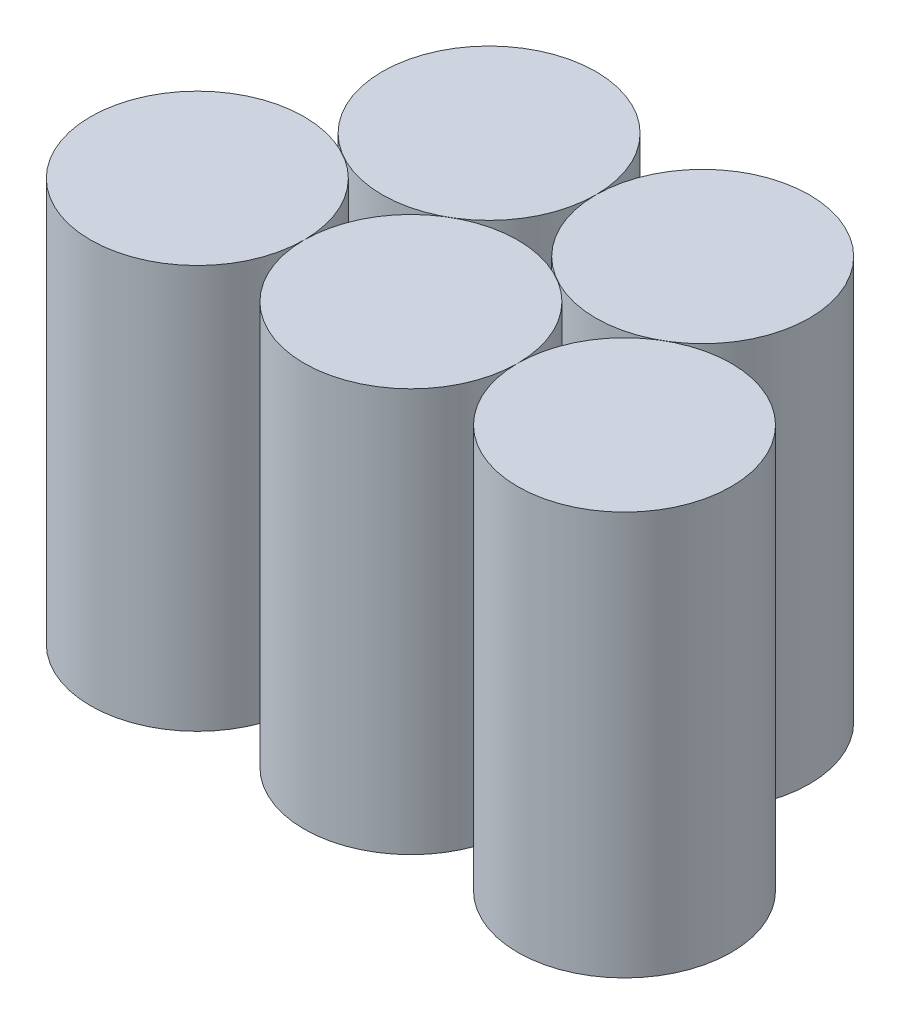
ISO-10303-21;
HEADER;
FILE_DESCRIPTION(('STEP AP214'),'2;1');
FILE_NAME('part.step','',(''),(''),'','','');
FILE_SCHEMA(('AUTOMOTIVE_DESIGN { 1 0 10303 214 1 1 1 1 }'));
ENDSEC;
DATA;
#1=APPLICATION_CONTEXT('core data for automotive mechanical design processes');
#2=APPLICATION_PROTOCOL_DEFINITION('international standard','automotive_design',2000,#1);
#3=PRODUCT_CONTEXT('',#1,'mechanical');
#4=PRODUCT('Part','Part','',(#3));
#5=PRODUCT_RELATED_PRODUCT_CATEGORY('part','',(#4));
#6=PRODUCT_DEFINITION_FORMATION('','',#4);
#7=PRODUCT_DEFINITION_CONTEXT('part definition',#1,'design');
#8=PRODUCT_DEFINITION('design','',#6,#7);
#9=PRODUCT_DEFINITION_SHAPE('','',#8);
#10=(LENGTH_UNIT() NAMED_UNIT(*) SI_UNIT(.MILLI.,.METRE.));
#11=(NAMED_UNIT(*) PLANE_ANGLE_UNIT() SI_UNIT($,.RADIAN.));
#12=(NAMED_UNIT(*) SI_UNIT($,.STERADIAN.) SOLID_ANGLE_UNIT());
#13=UNCERTAINTY_MEASURE_WITH_UNIT(LENGTH_MEASURE(1.E-05),#10,'distance_accuracy_value','');
#14=(GEOMETRIC_REPRESENTATION_CONTEXT(3) GLOBAL_UNCERTAINTY_ASSIGNED_CONTEXT((#13)) GLOBAL_UNIT_ASSIGNED_CONTEXT((#10,
#11,#12)) REPRESENTATION_CONTEXT('',''));
#15=CARTESIAN_POINT('',(0.,0.,0.));
#16=DIRECTION('',(0.,0.,1.));
#17=DIRECTION('',(1.,0.,0.));
#18=AXIS2_PLACEMENT_3D('',#15,#16,#17);
#19=CARTESIAN_POINT('',(22.86,43.18,11.43));
#20=DIRECTION('',(0.,-1.,0.));
#21=DIRECTION('',(0.,0.,-1.));
#22=AXIS2_PLACEMENT_3D('',#19,#20,#21);
#23=CYLINDRICAL_SURFACE('',#22,11.43);
#24=CARTESIAN_POINT('',(22.86,43.18,11.43));
#25=DIRECTION('',(0.,1.,0.));
#26=DIRECTION('',(0.,0.,1.));
#27=AXIS2_PLACEMENT_3D('',#24,#25,#26);
#28=CIRCLE('',#27,11.43);
#29=CARTESIAN_POINT('',(22.86,43.18,22.86));
#30=VERTEX_POINT('',#29);
#31=EDGE_CURVE('E12',#30,#30,#28,.T.);
#32=ORIENTED_EDGE('',*,*,#31,.F.);
#33=EDGE_LOOP('',(#32));
#34=FACE_BOUND('',#33,.T.);
#35=CARTESIAN_POINT('',(22.86,0.,11.43));
#36=DIRECTION('',(0.,1.,0.));
#37=DIRECTION('',(0.,0.,1.));
#38=AXIS2_PLACEMENT_3D('',#35,#36,#37);
#39=CIRCLE('',#38,11.43);
#40=CARTESIAN_POINT('',(22.86,0.,22.86));
#41=VERTEX_POINT('',#40);
#42=EDGE_CURVE('E85',#41,#41,#39,.T.);
#43=ORIENTED_EDGE('',*,*,#42,.T.);
#44=EDGE_LOOP('',(#43));
#45=FACE_BOUND('',#44,.T.);
#46=ADVANCED_FACE('F82',(#34,#45),#23,.T.);
#47=CARTESIAN_POINT('',(0.,43.18,0.));
#48=DIRECTION('',(0.,1.,0.));
#49=DIRECTION('',(0.,0.,1.));
#50=AXIS2_PLACEMENT_3D('',#47,#48,#49);
#51=PLANE('',#50);
#52=ORIENTED_EDGE('',*,*,#31,.T.);
#53=EDGE_LOOP('',(#52));
#54=FACE_BOUND('',#53,.T.);
#55=ADVANCED_FACE('F97',(#54),#51,.T.);
#56=CARTESIAN_POINT('',(0.,0.,0.));
#57=DIRECTION('',(0.,1.,0.));
#58=DIRECTION('',(0.,0.,1.));
#59=AXIS2_PLACEMENT_3D('',#56,#57,#58);
#60=PLANE('',#59);
#61=ORIENTED_EDGE('',*,*,#42,.F.);
#62=EDGE_LOOP('',(#61));
#63=FACE_BOUND('',#62,.T.);
#64=ADVANCED_FACE('F95',(#63),#60,.F.);
#65=CLOSED_SHELL('',(#46,#55,#64));
#66=MANIFOLD_SOLID_BREP('B2',#65);
#67=CARTESIAN_POINT('',(11.43,43.18,-8.36734073051227));
#68=DIRECTION('',(0.,-1.,0.));
#69=DIRECTION('',(0.,0.,-1.));
#70=AXIS2_PLACEMENT_3D('',#67,#68,#69);
#71=CYLINDRICAL_SURFACE('',#70,11.43);
#72=CARTESIAN_POINT('',(11.43,43.18,-8.36734073051227));
#73=DIRECTION('',(0.,1.,0.));
#74=DIRECTION('',(0.,0.,1.));
#75=AXIS2_PLACEMENT_3D('',#72,#73,#74);
#76=CIRCLE('',#75,11.43);
#77=CARTESIAN_POINT('',(11.43,43.18,3.06265926948773));
#78=VERTEX_POINT('',#77);
#79=EDGE_CURVE('E81',#78,#78,#76,.T.);
#80=ORIENTED_EDGE('',*,*,#79,.F.);
#81=EDGE_LOOP('',(#80));
#82=FACE_BOUND('',#81,.T.);
#83=CARTESIAN_POINT('',(11.43,0.,-8.36734073051227));
#84=DIRECTION('',(0.,1.,0.));
#85=DIRECTION('',(0.,0.,1.));
#86=AXIS2_PLACEMENT_3D('',#83,#84,#85);
#87=CIRCLE('',#86,11.43);
#88=CARTESIAN_POINT('',(11.43,0.,3.06265926948773));
#89=VERTEX_POINT('',#88);
#90=EDGE_CURVE('E134',#89,#89,#87,.T.);
#91=ORIENTED_EDGE('',*,*,#90,.T.);
#92=EDGE_LOOP('',(#91));
#93=FACE_BOUND('',#92,.T.);
#94=ADVANCED_FACE('F131',(#82,#93),#71,.T.);
#95=CARTESIAN_POINT('',(0.,43.18,0.));
#96=DIRECTION('',(0.,1.,0.));
#97=DIRECTION('',(0.,0.,1.));
#98=AXIS2_PLACEMENT_3D('',#95,#96,#97);
#99=PLANE('',#98);
#100=ORIENTED_EDGE('',*,*,#79,.T.);
#101=EDGE_LOOP('',(#100));
#102=FACE_BOUND('',#101,.T.);
#103=ADVANCED_FACE('F146',(#102),#99,.T.);
#104=CARTESIAN_POINT('',(0.,0.,0.));
#105=DIRECTION('',(0.,1.,0.));
#106=DIRECTION('',(0.,0.,1.));
#107=AXIS2_PLACEMENT_3D('',#104,#105,#106);
#108=PLANE('',#107);
#109=ORIENTED_EDGE('',*,*,#90,.F.);
#110=EDGE_LOOP('',(#109));
#111=FACE_BOUND('',#110,.T.);
#112=ADVANCED_FACE('F144',(#111),#108,.F.);
#113=CLOSED_SHELL('',(#94,#103,#112));
#114=MANIFOLD_SOLID_BREP('B7',#113);
#115=CARTESIAN_POINT('',(0.,43.18,11.43));
#116=DIRECTION('',(0.,-1.,0.));
#117=DIRECTION('',(0.,0.,-1.));
#118=AXIS2_PLACEMENT_3D('',#115,#116,#117);
#119=CYLINDRICAL_SURFACE('',#118,11.43);
#120=CARTESIAN_POINT('',(0.,43.18,11.43));
#121=DIRECTION('',(0.,1.,0.));
#122=DIRECTION('',(0.,0.,1.));
#123=AXIS2_PLACEMENT_3D('',#120,#121,#122);
#124=CIRCLE('',#123,11.43);
#125=CARTESIAN_POINT('',(0.,43.18,22.86));
#126=VERTEX_POINT('',#125);
#127=EDGE_CURVE('E130',#126,#126,#124,.T.);
#128=ORIENTED_EDGE('',*,*,#127,.F.);
#129=EDGE_LOOP('',(#128));
#130=FACE_BOUND('',#129,.T.);
#131=CARTESIAN_POINT('',(0.,0.,11.43));
#132=DIRECTION('',(0.,1.,0.));
#133=DIRECTION('',(0.,0.,1.));
#134=AXIS2_PLACEMENT_3D('',#131,#132,#133);
#135=CIRCLE('',#134,11.43);
#136=CARTESIAN_POINT('',(0.,0.,22.86));
#137=VERTEX_POINT('',#136);
#138=EDGE_CURVE('E183',#137,#137,#135,.T.);
#139=ORIENTED_EDGE('',*,*,#138,.T.);
#140=EDGE_LOOP('',(#139));
#141=FACE_BOUND('',#140,.T.);
#142=ADVANCED_FACE('F180',(#130,#141),#119,.T.);
#143=CARTESIAN_POINT('',(0.,43.18,0.));
#144=DIRECTION('',(0.,1.,0.));
#145=DIRECTION('',(0.,0.,1.));
#146=AXIS2_PLACEMENT_3D('',#143,#144,#145);
#147=PLANE('',#146);
#148=ORIENTED_EDGE('',*,*,#127,.T.);
#149=EDGE_LOOP('',(#148));
#150=FACE_BOUND('',#149,.T.);
#151=ADVANCED_FACE('F195',(#150),#147,.T.);
#152=CARTESIAN_POINT('',(0.,0.,0.));
#153=DIRECTION('',(0.,1.,0.));
#154=DIRECTION('',(0.,0.,1.));
#155=AXIS2_PLACEMENT_3D('',#152,#153,#154);
#156=PLANE('',#155);
#157=ORIENTED_EDGE('',*,*,#138,.F.);
#158=EDGE_LOOP('',(#157));
#159=FACE_BOUND('',#158,.T.);
#160=ADVANCED_FACE('F193',(#159),#156,.F.);
#161=CLOSED_SHELL('',(#142,#151,#160));
#162=MANIFOLD_SOLID_BREP('B76',#161);
#163=CARTESIAN_POINT('',(-11.43,43.18,-8.36734073051227));
#164=DIRECTION('',(0.,-1.,0.));
#165=DIRECTION('',(0.,0.,-1.));
#166=AXIS2_PLACEMENT_3D('',#163,#164,#165);
#167=CYLINDRICAL_SURFACE('',#166,11.43);
#168=CARTESIAN_POINT('',(-11.43,43.18,-8.36734073051227));
#169=DIRECTION('',(0.,1.,0.));
#170=DIRECTION('',(0.,0.,1.));
#171=AXIS2_PLACEMENT_3D('',#168,#169,#170);
#172=CIRCLE('',#171,11.43);
#173=CARTESIAN_POINT('',(-11.43,43.18,3.06265926948773));
#174=VERTEX_POINT('',#173);
#175=EDGE_CURVE('E179',#174,#174,#172,.T.);
#176=ORIENTED_EDGE('',*,*,#175,.F.);
#177=EDGE_LOOP('',(#176));
#178=FACE_BOUND('',#177,.T.);
#179=CARTESIAN_POINT('',(-11.43,0.,-8.36734073051227));
#180=DIRECTION('',(0.,1.,0.));
#181=DIRECTION('',(0.,0.,1.));
#182=AXIS2_PLACEMENT_3D('',#179,#180,#181);
#183=CIRCLE('',#182,11.43);
#184=CARTESIAN_POINT('',(-11.43,0.,3.06265926948773));
#185=VERTEX_POINT('',#184);
#186=EDGE_CURVE('E231',#185,#185,#183,.T.);
#187=ORIENTED_EDGE('',*,*,#186,.T.);
#188=EDGE_LOOP('',(#187));
#189=FACE_BOUND('',#188,.T.);
#190=ADVANCED_FACE('F228',(#178,#189),#167,.T.);
#191=CARTESIAN_POINT('',(0.,43.18,0.));
#192=DIRECTION('',(0.,1.,0.));
#193=DIRECTION('',(0.,0.,1.));
#194=AXIS2_PLACEMENT_3D('',#191,#192,#193);
#195=PLANE('',#194);
#196=ORIENTED_EDGE('',*,*,#175,.T.);
#197=EDGE_LOOP('',(#196));
#198=FACE_BOUND('',#197,.T.);
#199=ADVANCED_FACE('F245',(#198),#195,.T.);
#200=CARTESIAN_POINT('',(0.,0.,0.));
#201=DIRECTION('',(0.,1.,0.));
#202=DIRECTION('',(0.,0.,1.));
#203=AXIS2_PLACEMENT_3D('',#200,#201,#202);
#204=PLANE('',#203);
#205=ORIENTED_EDGE('',*,*,#186,.F.);
#206=EDGE_LOOP('',(#205));
#207=FACE_BOUND('',#206,.T.);
#208=ADVANCED_FACE('F243',(#207),#204,.F.);
#209=CLOSED_SHELL('',(#190,#199,#208));
#210=MANIFOLD_SOLID_BREP('B125',#209);
#211=CARTESIAN_POINT('',(-22.86,43.18,11.43));
#212=DIRECTION('',(0.,-1.,0.));
#213=DIRECTION('',(0.,0.,-1.));
#214=AXIS2_PLACEMENT_3D('',#211,#212,#213);
#215=CYLINDRICAL_SURFACE('',#214,11.43);
#216=CARTESIAN_POINT('',(-22.86,43.18,11.43));
#217=DIRECTION('',(0.,1.,0.));
#218=DIRECTION('',(0.,0.,1.));
#219=AXIS2_PLACEMENT_3D('',#216,#217,#218);
#220=CIRCLE('',#219,11.43);
#221=CARTESIAN_POINT('',(-22.86,43.18,22.86));
#222=VERTEX_POINT('',#221);
#223=EDGE_CURVE('E227',#222,#222,#220,.T.);
#224=ORIENTED_EDGE('',*,*,#223,.F.);
#225=EDGE_LOOP('',(#224));
#226=FACE_BOUND('',#225,.T.);
#227=CARTESIAN_POINT('',(-22.86,0.,11.43));
#228=DIRECTION('',(0.,1.,0.));
#229=DIRECTION('',(0.,0.,1.));
#230=AXIS2_PLACEMENT_3D('',#227,#228,#229);
#231=CIRCLE('',#230,11.43);
#232=CARTESIAN_POINT('',(-22.86,0.,22.86));
#233=VERTEX_POINT('',#232);
#234=EDGE_CURVE('E274',#233,#233,#231,.T.);
#235=ORIENTED_EDGE('',*,*,#234,.T.);
#236=EDGE_LOOP('',(#235));
#237=FACE_BOUND('',#236,.T.);
#238=ADVANCED_FACE('F271',(#226,#237),#215,.T.);
#239=CARTESIAN_POINT('',(0.,43.18,0.));
#240=DIRECTION('',(0.,1.,0.));
#241=DIRECTION('',(0.,0.,1.));
#242=AXIS2_PLACEMENT_3D('',#239,#240,#241);
#243=PLANE('',#242);
#244=ORIENTED_EDGE('',*,*,#223,.T.);
#245=EDGE_LOOP('',(#244));
#246=FACE_BOUND('',#245,.T.);
#247=ADVANCED_FACE('F286',(#246),#243,.T.);
#248=CARTESIAN_POINT('',(0.,0.,0.));
#249=DIRECTION('',(0.,1.,0.));
#250=DIRECTION('',(0.,0.,1.));
#251=AXIS2_PLACEMENT_3D('',#248,#249,#250);
#252=PLANE('',#251);
#253=ORIENTED_EDGE('',*,*,#234,.F.);
#254=EDGE_LOOP('',(#253));
#255=FACE_BOUND('',#254,.T.);
#256=ADVANCED_FACE('F284',(#255),#252,.F.);
#257=CLOSED_SHELL('',(#238,#247,#256));
#258=MANIFOLD_SOLID_BREP('B174',#257);
#259=ADVANCED_BREP_SHAPE_REPRESENTATION('',(#18,#66,#114,#162,#210,#258),#14);
#260=SHAPE_DEFINITION_REPRESENTATION(#9,#259);
ENDSEC;
END-ISO-10303-21;
